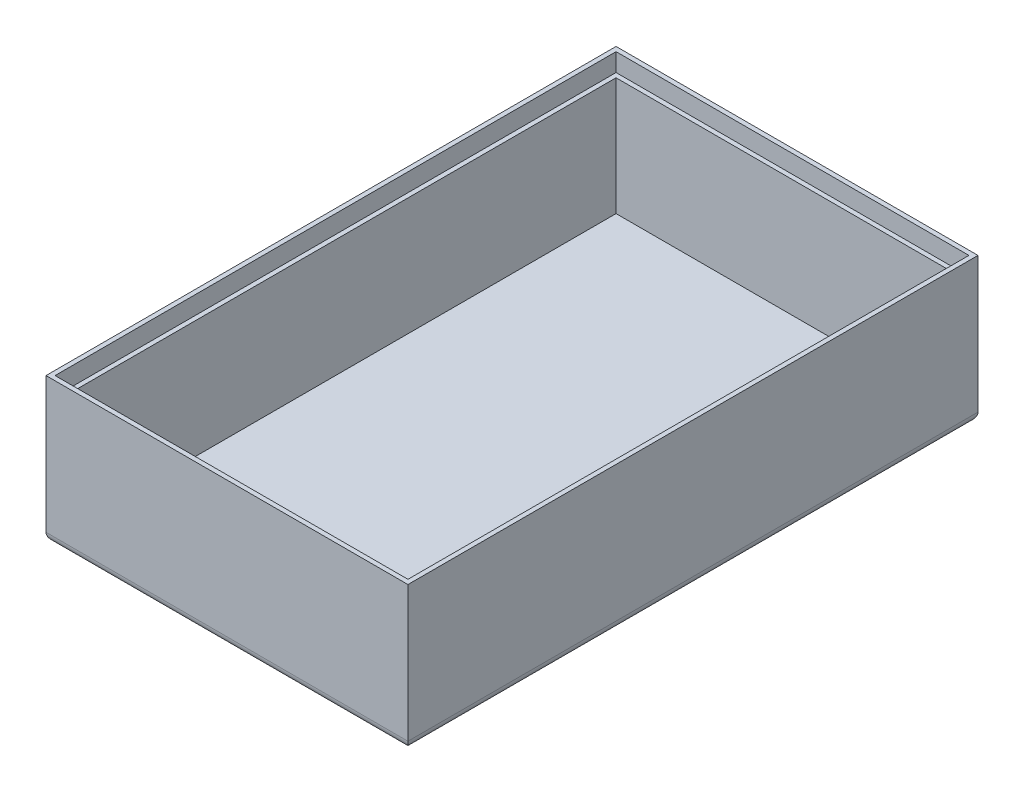
ISO-10303-21;
HEADER;
FILE_DESCRIPTION(('STEP AP214'),'2;1');
FILE_NAME('part.step','',(''),(''),'','','');
FILE_SCHEMA(('AUTOMOTIVE_DESIGN { 1 0 10303 214 1 1 1 1 }'));
ENDSEC;
DATA;
#1=APPLICATION_CONTEXT('core data for automotive mechanical design processes');
#2=APPLICATION_PROTOCOL_DEFINITION('international standard','automotive_design',2000,#1);
#3=PRODUCT_CONTEXT('',#1,'mechanical');
#4=PRODUCT('Part','Part','',(#3));
#5=PRODUCT_RELATED_PRODUCT_CATEGORY('part','',(#4));
#6=PRODUCT_DEFINITION_FORMATION('','',#4);
#7=PRODUCT_DEFINITION_CONTEXT('part definition',#1,'design');
#8=PRODUCT_DEFINITION('design','',#6,#7);
#9=PRODUCT_DEFINITION_SHAPE('','',#8);
#10=(LENGTH_UNIT() NAMED_UNIT(*) SI_UNIT(.MILLI.,.METRE.));
#11=(NAMED_UNIT(*) PLANE_ANGLE_UNIT() SI_UNIT($,.RADIAN.));
#12=(NAMED_UNIT(*) SI_UNIT($,.STERADIAN.) SOLID_ANGLE_UNIT());
#13=UNCERTAINTY_MEASURE_WITH_UNIT(LENGTH_MEASURE(1.E-05),#10,'distance_accuracy_value','');
#14=(GEOMETRIC_REPRESENTATION_CONTEXT(3) GLOBAL_UNCERTAINTY_ASSIGNED_CONTEXT((#13)) GLOBAL_UNIT_ASSIGNED_CONTEXT((#10,
#11,#12)) REPRESENTATION_CONTEXT('',''));
#15=CARTESIAN_POINT('',(0.,0.,0.));
#16=DIRECTION('',(0.,0.,1.));
#17=DIRECTION('',(1.,0.,0.));
#18=AXIS2_PLACEMENT_3D('',#15,#16,#17);
#19=CARTESIAN_POINT('',(-1.085,16.,-0.539));
#20=DIRECTION('',(1.,0.,0.));
#21=DIRECTION('',(0.,0.,-1.));
#22=AXIS2_PLACEMENT_3D('',#19,#20,#21);
#23=PLANE('',#22);
#24=DIRECTION('',(0.,-1.,0.));
#25=VECTOR('',#24,1.);
#26=CARTESIAN_POINT('',(-1.085,16.,-0.539));
#27=LINE('',#26,#25);
#28=CARTESIAN_POINT('',(-1.085,16.,-0.539));
#29=VERTEX_POINT('',#28);
#30=CARTESIAN_POINT('',(-1.085,1.,-0.539));
#31=VERTEX_POINT('',#30);
#32=EDGE_CURVE('E225',#29,#31,#27,.T.);
#33=ORIENTED_EDGE('',*,*,#32,.T.);
#34=DIRECTION('',(0.,0.,1.));
#35=VECTOR('',#34,1.);
#36=CARTESIAN_POINT('',(-1.085,1.,-0.539));
#37=LINE('',#36,#35);
#38=CARTESIAN_POINT('',(-1.08499999999999,1.,62.461));
#39=VERTEX_POINT('',#38);
#40=EDGE_CURVE('E43',#31,#39,#37,.T.);
#41=ORIENTED_EDGE('',*,*,#40,.T.);
#42=DIRECTION('',(0.,-1.,0.));
#43=VECTOR('',#42,1.);
#44=CARTESIAN_POINT('',(-1.08499999999999,16.,62.461));
#45=LINE('',#44,#43);
#46=CARTESIAN_POINT('',(-1.08499999999999,16.,62.461));
#47=VERTEX_POINT('',#46);
#48=EDGE_CURVE('E232',#47,#39,#45,.T.);
#49=ORIENTED_EDGE('',*,*,#48,.F.);
#50=DIRECTION('',(0.,0.,1.));
#51=VECTOR('',#50,1.);
#52=CARTESIAN_POINT('',(-1.085,16.,-0.539));
#53=LINE('',#52,#51);
#54=EDGE_CURVE('E208',#29,#47,#53,.T.);
#55=ORIENTED_EDGE('',*,*,#54,.F.);
#56=EDGE_LOOP('',(#33,#41,#49,#55));
#57=FACE_BOUND('',#56,.T.);
#58=ADVANCED_FACE('F34',(#57),#23,.F.);
#59=CARTESIAN_POINT('',(-1.08499999999999,16.,62.461));
#60=DIRECTION('',(0.,0.,-1.));
#61=DIRECTION('',(-1.,0.,0.));
#62=AXIS2_PLACEMENT_3D('',#59,#60,#61);
#63=PLANE('',#62);
#64=ORIENTED_EDGE('',*,*,#48,.T.);
#65=DIRECTION('',(1.,0.,0.));
#66=VECTOR('',#65,1.);
#67=CARTESIAN_POINT('',(-1.08499999999999,1.,62.461));
#68=LINE('',#67,#66);
#69=CARTESIAN_POINT('',(38.915,1.,62.461));
#70=VERTEX_POINT('',#69);
#71=EDGE_CURVE('E246',#39,#70,#68,.T.);
#72=ORIENTED_EDGE('',*,*,#71,.T.);
#73=DIRECTION('',(0.,-1.,0.));
#74=VECTOR('',#73,1.);
#75=CARTESIAN_POINT('',(38.915,16.,62.461));
#76=LINE('',#75,#74);
#77=CARTESIAN_POINT('',(38.915,16.,62.461));
#78=VERTEX_POINT('',#77);
#79=EDGE_CURVE('E229',#78,#70,#76,.T.);
#80=ORIENTED_EDGE('',*,*,#79,.F.);
#81=DIRECTION('',(1.,0.,0.));
#82=VECTOR('',#81,1.);
#83=CARTESIAN_POINT('',(-1.08499999999999,16.,62.461));
#84=LINE('',#83,#82);
#85=EDGE_CURVE('E219',#47,#78,#84,.T.);
#86=ORIENTED_EDGE('',*,*,#85,.F.);
#87=EDGE_LOOP('',(#64,#72,#80,#86));
#88=FACE_BOUND('',#87,.T.);
#89=ADVANCED_FACE('F284',(#88),#63,.F.);
#90=CARTESIAN_POINT('',(38.915,16.,-0.539));
#91=DIRECTION('',(-1.,0.,0.));
#92=DIRECTION('',(0.,0.,1.));
#93=AXIS2_PLACEMENT_3D('',#90,#91,#92);
#94=PLANE('',#93);
#95=ORIENTED_EDGE('',*,*,#79,.T.);
#96=DIRECTION('',(0.,0.,-1.));
#97=VECTOR('',#96,1.);
#98=CARTESIAN_POINT('',(38.915,1.,-0.539));
#99=LINE('',#98,#97);
#100=CARTESIAN_POINT('',(38.915,1.,-0.539));
#101=VERTEX_POINT('',#100);
#102=EDGE_CURVE('E234',#70,#101,#99,.T.);
#103=ORIENTED_EDGE('',*,*,#102,.T.);
#104=DIRECTION('',(0.,-1.,0.));
#105=VECTOR('',#104,1.);
#106=CARTESIAN_POINT('',(38.915,16.,-0.539));
#107=LINE('',#106,#105);
#108=CARTESIAN_POINT('',(38.915,16.,-0.539));
#109=VERTEX_POINT('',#108);
#110=EDGE_CURVE('E227',#109,#101,#107,.T.);
#111=ORIENTED_EDGE('',*,*,#110,.F.);
#112=DIRECTION('',(0.,0.,-1.));
#113=VECTOR('',#112,1.);
#114=CARTESIAN_POINT('',(38.915,16.,-0.539));
#115=LINE('',#114,#113);
#116=EDGE_CURVE('E221',#78,#109,#115,.T.);
#117=ORIENTED_EDGE('',*,*,#116,.F.);
#118=EDGE_LOOP('',(#95,#103,#111,#117));
#119=FACE_BOUND('',#118,.T.);
#120=ADVANCED_FACE('F275',(#119),#94,.F.);
#121=CARTESIAN_POINT('',(-1.085,16.,-0.539));
#122=DIRECTION('',(0.,0.,1.));
#123=DIRECTION('',(1.,0.,0.));
#124=AXIS2_PLACEMENT_3D('',#121,#122,#123);
#125=PLANE('',#124);
#126=ORIENTED_EDGE('',*,*,#110,.T.);
#127=DIRECTION('',(-1.,0.,0.));
#128=VECTOR('',#127,1.);
#129=CARTESIAN_POINT('',(-1.085,1.,-0.539));
#130=LINE('',#129,#128);
#131=EDGE_CURVE('E11',#101,#31,#130,.T.);
#132=ORIENTED_EDGE('',*,*,#131,.T.);
#133=ORIENTED_EDGE('',*,*,#32,.F.);
#134=DIRECTION('',(-1.,0.,0.));
#135=VECTOR('',#134,1.);
#136=CARTESIAN_POINT('',(-1.085,16.,-0.539));
#137=LINE('',#136,#135);
#138=EDGE_CURVE('E223',#109,#29,#137,.T.);
#139=ORIENTED_EDGE('',*,*,#138,.F.);
#140=EDGE_LOOP('',(#126,#132,#133,#139));
#141=FACE_BOUND('',#140,.T.);
#142=ADVANCED_FACE('F279',(#141),#125,.F.);
#143=CARTESIAN_POINT('',(0.,16.,0.));
#144=DIRECTION('',(0.,1.,0.));
#145=DIRECTION('',(0.,0.,1.));
#146=AXIS2_PLACEMENT_3D('',#143,#144,#145);
#147=PLANE('',#146);
#148=DIRECTION('',(-1.,0.,0.));
#149=VECTOR('',#148,1.);
#150=CARTESIAN_POINT('',(37.915,16.,-0.039));
#151=LINE('',#150,#149);
#152=CARTESIAN_POINT('',(38.415,16.,-0.0389999999999975));
#153=VERTEX_POINT('',#152);
#154=CARTESIAN_POINT('',(-0.585000000000013,16.,-0.039));
#155=VERTEX_POINT('',#154);
#156=EDGE_CURVE('E170',#153,#155,#151,.T.);
#157=ORIENTED_EDGE('',*,*,#156,.F.);
#158=DIRECTION('',(0.,0.,-1.));
#159=VECTOR('',#158,1.);
#160=CARTESIAN_POINT('',(38.415,16.,-0.0389999999999975));
#161=LINE('',#160,#159);
#162=CARTESIAN_POINT('',(38.415,16.,61.961));
#163=VERTEX_POINT('',#162);
#164=EDGE_CURVE('E162',#163,#153,#161,.T.);
#165=ORIENTED_EDGE('',*,*,#164,.F.);
#166=DIRECTION('',(1.,0.,0.));
#167=VECTOR('',#166,1.);
#168=CARTESIAN_POINT('',(37.915,16.,61.961));
#169=LINE('',#168,#167);
#170=CARTESIAN_POINT('',(-0.584999999999993,16.,61.961));
#171=VERTEX_POINT('',#170);
#172=EDGE_CURVE('E187',#171,#163,#169,.T.);
#173=ORIENTED_EDGE('',*,*,#172,.F.);
#174=DIRECTION('',(0.,0.,1.));
#175=VECTOR('',#174,1.);
#176=CARTESIAN_POINT('',(-0.585000000000001,16.,0.461));
#177=LINE('',#176,#175);
#178=EDGE_CURVE('E175',#155,#171,#177,.T.);
#179=ORIENTED_EDGE('',*,*,#178,.F.);
#180=EDGE_LOOP('',(#157,#165,#173,#179));
#181=FACE_BOUND('',#180,.T.);
#182=ORIENTED_EDGE('',*,*,#54,.T.);
#183=ORIENTED_EDGE('',*,*,#85,.T.);
#184=ORIENTED_EDGE('',*,*,#116,.T.);
#185=ORIENTED_EDGE('',*,*,#138,.T.);
#186=EDGE_LOOP('',(#182,#183,#184,#185));
#187=FACE_BOUND('',#186,.T.);
#188=ADVANCED_FACE('F282',(#181,#187),#147,.T.);
#189=CARTESIAN_POINT('',(0.,0.,0.));
#190=DIRECTION('',(0.,1.,0.));
#191=DIRECTION('',(0.,0.,1.));
#192=AXIS2_PLACEMENT_3D('',#189,#190,#191);
#193=PLANE('',#192);
#194=DIRECTION('',(-1.,0.,0.));
#195=VECTOR('',#194,1.);
#196=CARTESIAN_POINT('',(0.,0.,0.461));
#197=LINE('',#196,#195);
#198=CARTESIAN_POINT('',(-0.0850000000000003,0.,0.461));
#199=VERTEX_POINT('',#198);
#200=CARTESIAN_POINT('',(37.915,0.,0.461));
#201=VERTEX_POINT('',#200);
#202=EDGE_CURVE('E237',#199,#201,#197,.F.);
#203=ORIENTED_EDGE('',*,*,#202,.T.);
#204=DIRECTION('',(0.,0.,-1.));
#205=VECTOR('',#204,1.);
#206=CARTESIAN_POINT('',(37.915,0.,0.));
#207=LINE('',#206,#205);
#208=CARTESIAN_POINT('',(37.915,0.,61.461));
#209=VERTEX_POINT('',#208);
#210=EDGE_CURVE('E243',#201,#209,#207,.F.);
#211=ORIENTED_EDGE('',*,*,#210,.T.);
#212=DIRECTION('',(1.,0.,0.));
#213=VECTOR('',#212,1.);
#214=CARTESIAN_POINT('',(0.,0.,61.461));
#215=LINE('',#214,#213);
#216=CARTESIAN_POINT('',(-0.0849999999999925,0.,61.461));
#217=VERTEX_POINT('',#216);
#218=EDGE_CURVE('E241',#209,#217,#215,.F.);
#219=ORIENTED_EDGE('',*,*,#218,.T.);
#220=DIRECTION('',(0.,0.,1.));
#221=VECTOR('',#220,1.);
#222=CARTESIAN_POINT('',(-0.0850000000000004,0.,0.));
#223=LINE('',#222,#221);
#224=EDGE_CURVE('E239',#217,#199,#223,.F.);
#225=ORIENTED_EDGE('',*,*,#224,.T.);
#226=EDGE_LOOP('',(#203,#211,#219,#225));
#227=FACE_BOUND('',#226,.T.);
#228=ADVANCED_FACE('F266',(#227),#193,.F.);
#229=CARTESIAN_POINT('',(-0.0850000000000007,1.,0.461));
#230=DIRECTION('',(-1.,0.,0.));
#231=DIRECTION('',(0.,0.,1.));
#232=AXIS2_PLACEMENT_3D('',#229,#230,#231);
#233=PLANE('',#232);
#234=DIRECTION('',(0.,1.,0.));
#235=VECTOR('',#234,1.);
#236=CARTESIAN_POINT('',(-0.0850000000000007,1.,0.461));
#237=LINE('',#236,#235);
#238=CARTESIAN_POINT('',(-0.0850000000000007,1.,0.461));
#239=VERTEX_POINT('',#238);
#240=CARTESIAN_POINT('',(-0.0850000000000017,14.,0.461));
#241=VERTEX_POINT('',#240);
#242=EDGE_CURVE('E205',#239,#241,#237,.T.);
#243=ORIENTED_EDGE('',*,*,#242,.T.);
#244=DIRECTION('',(0.,0.,-1.));
#245=VECTOR('',#244,1.);
#246=CARTESIAN_POINT('',(-0.0850000000000007,14.,0.461));
#247=LINE('',#246,#245);
#248=CARTESIAN_POINT('',(-0.0849999999999932,14.,61.461));
#249=VERTEX_POINT('',#248);
#250=EDGE_CURVE('E149',#249,#241,#247,.T.);
#251=ORIENTED_EDGE('',*,*,#250,.F.);
#252=DIRECTION('',(0.,1.,0.));
#253=VECTOR('',#252,1.);
#254=CARTESIAN_POINT('',(-0.084999999999993,1.,61.461));
#255=LINE('',#254,#253);
#256=CARTESIAN_POINT('',(-0.084999999999993,1.,61.461));
#257=VERTEX_POINT('',#256);
#258=EDGE_CURVE('E204',#257,#249,#255,.T.);
#259=ORIENTED_EDGE('',*,*,#258,.F.);
#260=DIRECTION('',(0.,0.,1.));
#261=VECTOR('',#260,1.);
#262=CARTESIAN_POINT('',(-0.0850000000000007,1.,0.461));
#263=LINE('',#262,#261);
#264=EDGE_CURVE('E192',#239,#257,#263,.T.);
#265=ORIENTED_EDGE('',*,*,#264,.F.);
#266=EDGE_LOOP('',(#243,#251,#259,#265));
#267=FACE_BOUND('',#266,.T.);
#268=ADVANCED_FACE('F319',(#267),#233,.F.);
#269=CARTESIAN_POINT('',(-0.0850000000000007,1.,0.461));
#270=DIRECTION('',(0.,0.,-1.));
#271=DIRECTION('',(-1.,0.,0.));
#272=AXIS2_PLACEMENT_3D('',#269,#270,#271);
#273=PLANE('',#272);
#274=DIRECTION('',(0.,1.,0.));
#275=VECTOR('',#274,1.);
#276=CARTESIAN_POINT('',(37.915,1.,0.461));
#277=LINE('',#276,#275);
#278=CARTESIAN_POINT('',(37.915,1.,0.461));
#279=VERTEX_POINT('',#278);
#280=CARTESIAN_POINT('',(37.915,14.,0.461000000000003));
#281=VERTEX_POINT('',#280);
#282=EDGE_CURVE('E209',#279,#281,#277,.T.);
#283=ORIENTED_EDGE('',*,*,#282,.T.);
#284=DIRECTION('',(1.,0.,0.));
#285=VECTOR('',#284,1.);
#286=CARTESIAN_POINT('',(37.915,14.,0.461));
#287=LINE('',#286,#285);
#288=EDGE_CURVE('E168',#241,#281,#287,.T.);
#289=ORIENTED_EDGE('',*,*,#288,.F.);
#290=ORIENTED_EDGE('',*,*,#242,.F.);
#291=DIRECTION('',(-1.,0.,0.));
#292=VECTOR('',#291,1.);
#293=CARTESIAN_POINT('',(-0.0850000000000007,1.,0.461));
#294=LINE('',#293,#292);
#295=EDGE_CURVE('E201',#279,#239,#294,.T.);
#296=ORIENTED_EDGE('',*,*,#295,.F.);
#297=EDGE_LOOP('',(#283,#289,#290,#296));
#298=FACE_BOUND('',#297,.T.);
#299=ADVANCED_FACE('F316',(#298),#273,.F.);
#300=CARTESIAN_POINT('',(37.915,1.,0.461));
#301=DIRECTION('',(1.,0.,0.));
#302=DIRECTION('',(0.,0.,-1.));
#303=AXIS2_PLACEMENT_3D('',#300,#301,#302);
#304=PLANE('',#303);
#305=DIRECTION('',(0.,1.,0.));
#306=VECTOR('',#305,1.);
#307=CARTESIAN_POINT('',(37.915,1.,61.461));
#308=LINE('',#307,#306);
#309=CARTESIAN_POINT('',(37.915,1.,61.461));
#310=VERTEX_POINT('',#309);
#311=CARTESIAN_POINT('',(37.915,14.,61.461));
#312=VERTEX_POINT('',#311);
#313=EDGE_CURVE('E212',#310,#312,#308,.T.);
#314=ORIENTED_EDGE('',*,*,#313,.T.);
#315=DIRECTION('',(0.,0.,1.));
#316=VECTOR('',#315,1.);
#317=CARTESIAN_POINT('',(37.915,14.,-0.0389999999999974));
#318=LINE('',#317,#316);
#319=EDGE_CURVE('E163',#281,#312,#318,.T.);
#320=ORIENTED_EDGE('',*,*,#319,.F.);
#321=ORIENTED_EDGE('',*,*,#282,.F.);
#322=DIRECTION('',(0.,0.,-1.));
#323=VECTOR('',#322,1.);
#324=CARTESIAN_POINT('',(37.915,1.,0.461));
#325=LINE('',#324,#323);
#326=EDGE_CURVE('E198',#310,#279,#325,.T.);
#327=ORIENTED_EDGE('',*,*,#326,.F.);
#328=EDGE_LOOP('',(#314,#320,#321,#327));
#329=FACE_BOUND('',#328,.T.);
#330=ADVANCED_FACE('F310',(#329),#304,.F.);
#331=CARTESIAN_POINT('',(-0.084999999999993,1.,61.461));
#332=DIRECTION('',(0.,0.,1.));
#333=DIRECTION('',(1.,0.,0.));
#334=AXIS2_PLACEMENT_3D('',#331,#332,#333);
#335=PLANE('',#334);
#336=ORIENTED_EDGE('',*,*,#258,.T.);
#337=DIRECTION('',(-1.,0.,0.));
#338=VECTOR('',#337,1.);
#339=CARTESIAN_POINT('',(37.915,14.,61.461));
#340=LINE('',#339,#338);
#341=EDGE_CURVE('E183',#312,#249,#340,.T.);
#342=ORIENTED_EDGE('',*,*,#341,.F.);
#343=ORIENTED_EDGE('',*,*,#313,.F.);
#344=DIRECTION('',(1.,0.,0.));
#345=VECTOR('',#344,1.);
#346=CARTESIAN_POINT('',(-0.084999999999993,1.,61.461));
#347=LINE('',#346,#345);
#348=EDGE_CURVE('E195',#257,#310,#347,.T.);
#349=ORIENTED_EDGE('',*,*,#348,.F.);
#350=EDGE_LOOP('',(#336,#342,#343,#349));
#351=FACE_BOUND('',#350,.T.);
#352=ADVANCED_FACE('F304',(#351),#335,.F.);
#353=CARTESIAN_POINT('',(0.,1.,0.));
#354=DIRECTION('',(0.,1.,0.));
#355=DIRECTION('',(0.,0.,1.));
#356=AXIS2_PLACEMENT_3D('',#353,#354,#355);
#357=PLANE('',#356);
#358=ORIENTED_EDGE('',*,*,#264,.T.);
#359=ORIENTED_EDGE('',*,*,#348,.T.);
#360=ORIENTED_EDGE('',*,*,#326,.T.);
#361=ORIENTED_EDGE('',*,*,#295,.T.);
#362=EDGE_LOOP('',(#358,#359,#360,#361));
#363=FACE_BOUND('',#362,.T.);
#364=ADVANCED_FACE('F300',(#363),#357,.T.);
#365=CARTESIAN_POINT('',(-0.0850000000000004,1.,-0.539));
#366=DIRECTION('',(0.,0.,1.));
#367=DIRECTION('',(1.,0.,0.));
#368=AXIS2_PLACEMENT_3D('',#365,#366,#367);
#369=CYLINDRICAL_SURFACE('',#368,1.);
#370=CARTESIAN_POINT('',(-0.0850000000000003,1.,0.461));
#371=DIRECTION('',(-0.707106781186547,0.,0.707106781186548));
#372=DIRECTION('',(-0.707106781186548,0.,-0.707106781186547));
#373=AXIS2_PLACEMENT_3D('',#370,#371,#372);
#374=ELLIPSE('',#373,1.4142135623731,1.);
#375=EDGE_CURVE('E251',#199,#31,#374,.F.);
#376=ORIENTED_EDGE('',*,*,#375,.F.);
#377=ORIENTED_EDGE('',*,*,#224,.F.);
#378=CARTESIAN_POINT('',(-0.0849999999999926,1.,61.461));
#379=DIRECTION('',(0.707106781186548,0.,0.707106781186547));
#380=DIRECTION('',(-0.707106781186547,0.,0.707106781186548));
#381=AXIS2_PLACEMENT_3D('',#378,#379,#380);
#382=ELLIPSE('',#381,1.41421356237309,1.);
#383=EDGE_CURVE('E38',#39,#217,#382,.T.);
#384=ORIENTED_EDGE('',*,*,#383,.F.);
#385=ORIENTED_EDGE('',*,*,#40,.F.);
#386=EDGE_LOOP('',(#376,#377,#384,#385));
#387=FACE_BOUND('',#386,.T.);
#388=ADVANCED_FACE('F36',(#387),#369,.T.);
#389=CARTESIAN_POINT('',(-1.08499999999999,1.,61.461));
#390=DIRECTION('',(1.,0.,0.));
#391=DIRECTION('',(0.,0.,-1.));
#392=AXIS2_PLACEMENT_3D('',#389,#390,#391);
#393=CYLINDRICAL_SURFACE('',#392,1.);
#394=ORIENTED_EDGE('',*,*,#383,.T.);
#395=ORIENTED_EDGE('',*,*,#218,.F.);
#396=CARTESIAN_POINT('',(37.915,1.,61.461));
#397=DIRECTION('',(0.707106781186547,0.,-0.707106781186548));
#398=DIRECTION('',(0.707106781186547,0.,0.707106781186547));
#399=AXIS2_PLACEMENT_3D('',#396,#397,#398);
#400=ELLIPSE('',#399,1.4142135623731,1.);
#401=EDGE_CURVE('E250',#70,#209,#400,.T.);
#402=ORIENTED_EDGE('',*,*,#401,.F.);
#403=ORIENTED_EDGE('',*,*,#71,.F.);
#404=EDGE_LOOP('',(#394,#395,#402,#403));
#405=FACE_BOUND('',#404,.T.);
#406=ADVANCED_FACE('F261',(#405),#393,.T.);
#407=CARTESIAN_POINT('',(-1.085,1.,0.461));
#408=DIRECTION('',(-1.,0.,0.));
#409=DIRECTION('',(0.,0.,1.));
#410=AXIS2_PLACEMENT_3D('',#407,#408,#409);
#411=CYLINDRICAL_SURFACE('',#410,1.);
#412=ORIENTED_EDGE('',*,*,#375,.T.);
#413=ORIENTED_EDGE('',*,*,#131,.F.);
#414=CARTESIAN_POINT('',(37.915,1.,0.461));
#415=DIRECTION('',(-0.707106781186547,0.,-0.707106781186547));
#416=DIRECTION('',(-0.707106781186547,0.,0.707106781186548));
#417=AXIS2_PLACEMENT_3D('',#414,#415,#416);
#418=ELLIPSE('',#417,1.41421356237309,1.);
#419=EDGE_CURVE('E189',#201,#101,#418,.F.);
#420=ORIENTED_EDGE('',*,*,#419,.F.);
#421=ORIENTED_EDGE('',*,*,#202,.F.);
#422=EDGE_LOOP('',(#412,#413,#420,#421));
#423=FACE_BOUND('',#422,.T.);
#424=ADVANCED_FACE('F272',(#423),#411,.T.);
#425=CARTESIAN_POINT('',(37.915,1.,-0.539));
#426=DIRECTION('',(0.,0.,-1.));
#427=DIRECTION('',(-1.,0.,0.));
#428=AXIS2_PLACEMENT_3D('',#425,#426,#427);
#429=CYLINDRICAL_SURFACE('',#428,1.);
#430=ORIENTED_EDGE('',*,*,#401,.T.);
#431=ORIENTED_EDGE('',*,*,#210,.F.);
#432=ORIENTED_EDGE('',*,*,#419,.T.);
#433=ORIENTED_EDGE('',*,*,#102,.F.);
#434=EDGE_LOOP('',(#430,#431,#432,#433));
#435=FACE_BOUND('',#434,.T.);
#436=ADVANCED_FACE('F270',(#435),#429,.T.);
#437=CARTESIAN_POINT('',(37.915,14.,61.961));
#438=DIRECTION('',(0.,-1.,0.));
#439=DIRECTION('',(0.,0.,-1.));
#440=AXIS2_PLACEMENT_3D('',#437,#438,#439);
#441=PLANE('',#440);
#442=ORIENTED_EDGE('',*,*,#319,.T.);
#443=ORIENTED_EDGE('',*,*,#341,.T.);
#444=ORIENTED_EDGE('',*,*,#250,.T.);
#445=ORIENTED_EDGE('',*,*,#288,.T.);
#446=EDGE_LOOP('',(#442,#443,#444,#445));
#447=FACE_BOUND('',#446,.T.);
#448=DIRECTION('',(-1.,0.,0.));
#449=VECTOR('',#448,1.);
#450=CARTESIAN_POINT('',(37.915,14.,61.961));
#451=LINE('',#450,#449);
#452=CARTESIAN_POINT('',(38.415,14.,61.961));
#453=VERTEX_POINT('',#452);
#454=CARTESIAN_POINT('',(-0.584999999999993,14.,61.961));
#455=VERTEX_POINT('',#454);
#456=EDGE_CURVE('E154',#453,#455,#451,.T.);
#457=ORIENTED_EDGE('',*,*,#456,.F.);
#458=DIRECTION('',(0.,0.,1.));
#459=VECTOR('',#458,1.);
#460=CARTESIAN_POINT('',(38.415,14.,-0.0389999999999975));
#461=LINE('',#460,#459);
#462=CARTESIAN_POINT('',(38.415,14.,-0.0389999999999975));
#463=VERTEX_POINT('',#462);
#464=EDGE_CURVE('E152',#463,#453,#461,.T.);
#465=ORIENTED_EDGE('',*,*,#464,.F.);
#466=DIRECTION('',(1.,0.,0.));
#467=VECTOR('',#466,1.);
#468=CARTESIAN_POINT('',(37.915,14.,-0.039));
#469=LINE('',#468,#467);
#470=CARTESIAN_POINT('',(-0.585000000000006,14.,-0.039));
#471=VERTEX_POINT('',#470);
#472=EDGE_CURVE('E138',#471,#463,#469,.T.);
#473=ORIENTED_EDGE('',*,*,#472,.F.);
#474=DIRECTION('',(0.,0.,-1.));
#475=VECTOR('',#474,1.);
#476=CARTESIAN_POINT('',(-0.585000000000001,14.,0.461));
#477=LINE('',#476,#475);
#478=EDGE_CURVE('E181',#455,#471,#477,.T.);
#479=ORIENTED_EDGE('',*,*,#478,.F.);
#480=EDGE_LOOP('',(#457,#465,#473,#479));
#481=FACE_BOUND('',#480,.T.);
#482=ADVANCED_FACE('F153',(#447,#481),#441,.F.);
#483=CARTESIAN_POINT('',(0.,0.,61.961));
#484=DIRECTION('',(0.,0.,-1.));
#485=DIRECTION('',(-1.,0.,0.));
#486=AXIS2_PLACEMENT_3D('',#483,#484,#485);
#487=PLANE('',#486);
#488=ORIENTED_EDGE('',*,*,#172,.T.);
#489=DIRECTION('',(0.,1.,0.));
#490=VECTOR('',#489,1.);
#491=CARTESIAN_POINT('',(38.415,16.,61.961));
#492=LINE('',#491,#490);
#493=EDGE_CURVE('E158',#453,#163,#492,.T.);
#494=ORIENTED_EDGE('',*,*,#493,.F.);
#495=ORIENTED_EDGE('',*,*,#456,.T.);
#496=DIRECTION('',(0.,-1.,0.));
#497=VECTOR('',#496,1.);
#498=CARTESIAN_POINT('',(-0.584999999999993,16.,61.961));
#499=LINE('',#498,#497);
#500=EDGE_CURVE('E178',#171,#455,#499,.T.);
#501=ORIENTED_EDGE('',*,*,#500,.F.);
#502=EDGE_LOOP('',(#488,#494,#495,#501));
#503=FACE_BOUND('',#502,.T.);
#504=ADVANCED_FACE('F379',(#503),#487,.T.);
#505=CARTESIAN_POINT('',(-0.585000000000001,0.,0.));
#506=DIRECTION('',(-1.,0.,0.));
#507=DIRECTION('',(0.,0.,1.));
#508=AXIS2_PLACEMENT_3D('',#505,#506,#507);
#509=PLANE('',#508);
#510=ORIENTED_EDGE('',*,*,#478,.T.);
#511=DIRECTION('',(0.,-1.,0.));
#512=VECTOR('',#511,1.);
#513=CARTESIAN_POINT('',(-0.585000000000013,16.,-0.039));
#514=LINE('',#513,#512);
#515=EDGE_CURVE('E146',#155,#471,#514,.T.);
#516=ORIENTED_EDGE('',*,*,#515,.F.);
#517=ORIENTED_EDGE('',*,*,#178,.T.);
#518=ORIENTED_EDGE('',*,*,#500,.T.);
#519=EDGE_LOOP('',(#510,#516,#517,#518));
#520=FACE_BOUND('',#519,.T.);
#521=ADVANCED_FACE('F390',(#520),#509,.F.);
#522=CARTESIAN_POINT('',(0.,0.,-0.039));
#523=DIRECTION('',(0.,0.,-1.));
#524=DIRECTION('',(-1.,0.,0.));
#525=AXIS2_PLACEMENT_3D('',#522,#523,#524);
#526=PLANE('',#525);
#527=ORIENTED_EDGE('',*,*,#472,.T.);
#528=DIRECTION('',(0.,-1.,0.));
#529=VECTOR('',#528,1.);
#530=CARTESIAN_POINT('',(38.415,16.,-0.0389999999999975));
#531=LINE('',#530,#529);
#532=EDGE_CURVE('E143',#153,#463,#531,.T.);
#533=ORIENTED_EDGE('',*,*,#532,.F.);
#534=ORIENTED_EDGE('',*,*,#156,.T.);
#535=ORIENTED_EDGE('',*,*,#515,.T.);
#536=EDGE_LOOP('',(#527,#533,#534,#535));
#537=FACE_BOUND('',#536,.T.);
#538=ADVANCED_FACE('F140',(#537),#526,.F.);
#539=CARTESIAN_POINT('',(38.415,0.,0.));
#540=DIRECTION('',(-1.,0.,0.));
#541=DIRECTION('',(0.,0.,1.));
#542=AXIS2_PLACEMENT_3D('',#539,#540,#541);
#543=PLANE('',#542);
#544=ORIENTED_EDGE('',*,*,#532,.T.);
#545=ORIENTED_EDGE('',*,*,#464,.T.);
#546=ORIENTED_EDGE('',*,*,#493,.T.);
#547=ORIENTED_EDGE('',*,*,#164,.T.);
#548=EDGE_LOOP('',(#544,#545,#546,#547));
#549=FACE_BOUND('',#548,.T.);
#550=ADVANCED_FACE('F160',(#549),#543,.T.);
#551=CLOSED_SHELL('',(#58,#89,#120,#142,#188,#228,#268,#299,#330,#352,#364,#388,#406,#424,#436,
#482,#504,#521,#538,#550));
#552=MANIFOLD_SOLID_BREP('B2',#551);
#553=ADVANCED_BREP_SHAPE_REPRESENTATION('',(#18,#552),#14);
#554=SHAPE_DEFINITION_REPRESENTATION(#9,#553);
ENDSEC;
END-ISO-10303-21;
